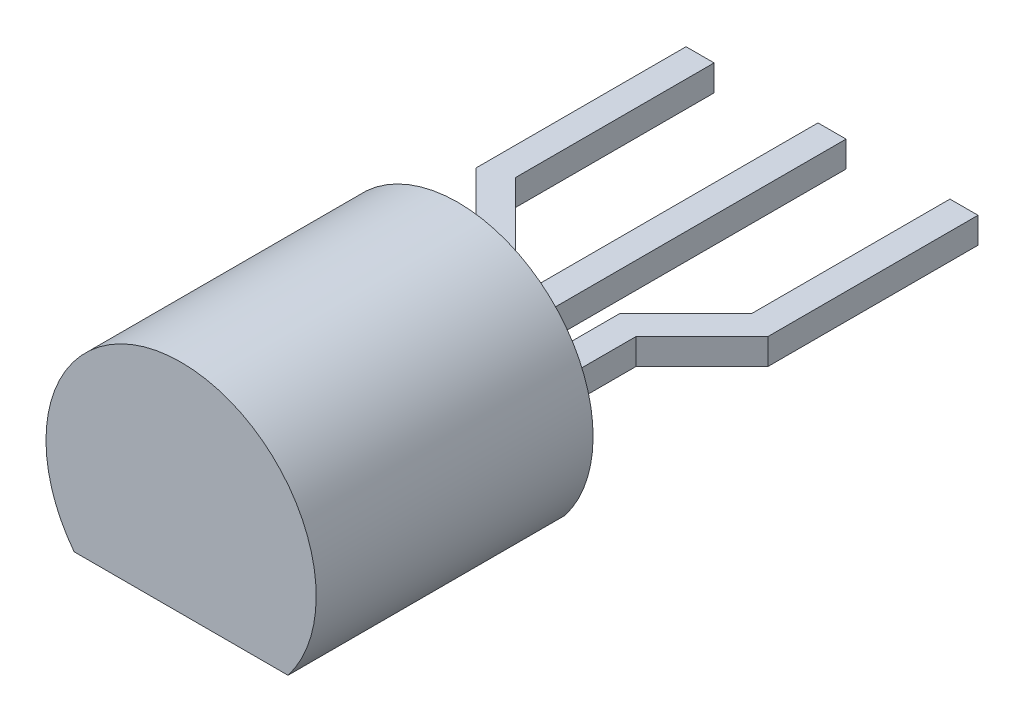
ISO-10303-21;
HEADER;
FILE_DESCRIPTION(('STEP AP214'),'2;1');
FILE_NAME('part.step','',(''),(''),'','','');
FILE_SCHEMA(('AUTOMOTIVE_DESIGN { 1 0 10303 214 1 1 1 1 }'));
ENDSEC;
DATA;
#1=APPLICATION_CONTEXT('core data for automotive mechanical design processes');
#2=APPLICATION_PROTOCOL_DEFINITION('international standard','automotive_design',2000,#1);
#3=PRODUCT_CONTEXT('',#1,'mechanical');
#4=PRODUCT('Part','Part','',(#3));
#5=PRODUCT_RELATED_PRODUCT_CATEGORY('part','',(#4));
#6=PRODUCT_DEFINITION_FORMATION('','',#4);
#7=PRODUCT_DEFINITION_CONTEXT('part definition',#1,'design');
#8=PRODUCT_DEFINITION('design','',#6,#7);
#9=PRODUCT_DEFINITION_SHAPE('','',#8);
#10=(LENGTH_UNIT() NAMED_UNIT(*) SI_UNIT(.MILLI.,.METRE.));
#11=(NAMED_UNIT(*) PLANE_ANGLE_UNIT() SI_UNIT($,.RADIAN.));
#12=(NAMED_UNIT(*) SI_UNIT($,.STERADIAN.) SOLID_ANGLE_UNIT());
#13=UNCERTAINTY_MEASURE_WITH_UNIT(LENGTH_MEASURE(1.E-05),#10,'distance_accuracy_value','');
#14=(GEOMETRIC_REPRESENTATION_CONTEXT(3) GLOBAL_UNCERTAINTY_ASSIGNED_CONTEXT((#13)) GLOBAL_UNIT_ASSIGNED_CONTEXT((#10,
#11,#12)) REPRESENTATION_CONTEXT('',''));
#15=CARTESIAN_POINT('',(0.,0.,0.));
#16=DIRECTION('',(0.,0.,1.));
#17=DIRECTION('',(1.,0.,0.));
#18=AXIS2_PLACEMENT_3D('',#15,#16,#17);
#19=CARTESIAN_POINT('',(-0.27,0.25,-3.2));
#20=DIRECTION('',(0.,1.,0.));
#21=DIRECTION('',(0.,0.,1.));
#22=AXIS2_PLACEMENT_3D('',#19,#20,#21);
#23=PLANE('',#22);
#24=DIRECTION('',(1.,0.,0.));
#25=VECTOR('',#24,1.);
#26=CARTESIAN_POINT('',(0.,0.25,-3.2));
#27=LINE('',#26,#25);
#28=CARTESIAN_POINT('',(0.27,0.25,-3.2));
#29=VERTEX_POINT('',#28);
#30=CARTESIAN_POINT('',(-0.27,0.25,-3.2));
#31=VERTEX_POINT('',#30);
#32=EDGE_CURVE('P0_E54',#29,#31,#27,.F.);
#33=ORIENTED_EDGE('',*,*,#32,.T.);
#34=DIRECTION('',(0.,0.,1.));
#35=VECTOR('',#34,1.);
#36=CARTESIAN_POINT('',(-0.27,0.25,-3.2));
#37=LINE('',#36,#35);
#38=CARTESIAN_POINT('',(-0.27,0.25,4.));
#39=VERTEX_POINT('',#38);
#40=EDGE_CURVE('P0_E66',#39,#31,#37,.F.);
#41=ORIENTED_EDGE('',*,*,#40,.F.);
#42=DIRECTION('',(1.,0.,0.));
#43=VECTOR('',#42,1.);
#44=CARTESIAN_POINT('',(0.,0.25,4.));
#45=LINE('',#44,#43);
#46=CARTESIAN_POINT('',(0.27,0.25,4.));
#47=VERTEX_POINT('',#46);
#48=EDGE_CURVE('P0_E19',#47,#39,#45,.F.);
#49=ORIENTED_EDGE('',*,*,#48,.F.);
#50=DIRECTION('',(0.,0.,-1.));
#51=VECTOR('',#50,1.);
#52=CARTESIAN_POINT('',(0.27,0.25,-3.2));
#53=LINE('',#52,#51);
#54=EDGE_CURVE('P0_E80',#29,#47,#53,.F.);
#55=ORIENTED_EDGE('',*,*,#54,.F.);
#56=EDGE_LOOP('',(#33,#41,#49,#55));
#57=FACE_BOUND('',#56,.T.);
#58=ADVANCED_FACE('P0_F16',(#57),#23,.T.);
#59=CARTESIAN_POINT('',(0.,0.,4.));
#60=DIRECTION('',(0.,0.,1.));
#61=DIRECTION('',(1.,0.,0.));
#62=AXIS2_PLACEMENT_3D('',#59,#60,#61);
#63=PLANE('',#62);
#64=ORIENTED_EDGE('',*,*,#48,.T.);
#65=DIRECTION('',(0.,1.,0.));
#66=VECTOR('',#65,1.);
#67=CARTESIAN_POINT('',(-0.27,-0.25,4.));
#68=LINE('',#67,#66);
#69=CARTESIAN_POINT('',(-0.27,-0.25,4.));
#70=VERTEX_POINT('',#69);
#71=EDGE_CURVE('P0_E61',#70,#39,#68,.T.);
#72=ORIENTED_EDGE('',*,*,#71,.F.);
#73=DIRECTION('',(1.,0.,0.));
#74=VECTOR('',#73,1.);
#75=CARTESIAN_POINT('',(0.27,-0.25,4.));
#76=LINE('',#75,#74);
#77=CARTESIAN_POINT('',(0.27,-0.25,4.));
#78=VERTEX_POINT('',#77);
#79=EDGE_CURVE('P0_E82',#78,#70,#76,.F.);
#80=ORIENTED_EDGE('',*,*,#79,.F.);
#81=DIRECTION('',(0.,1.,0.));
#82=VECTOR('',#81,1.);
#83=CARTESIAN_POINT('',(0.27,0.25,4.));
#84=LINE('',#83,#82);
#85=EDGE_CURVE('P0_E64',#47,#78,#84,.F.);
#86=ORIENTED_EDGE('',*,*,#85,.F.);
#87=EDGE_LOOP('',(#64,#72,#80,#86));
#88=FACE_BOUND('',#87,.T.);
#89=ADVANCED_FACE('P0_F59',(#88),#63,.T.);
#90=CARTESIAN_POINT('',(-0.27,-0.25,-3.2));
#91=DIRECTION('',(-1.,0.,0.));
#92=DIRECTION('',(0.,0.,1.));
#93=AXIS2_PLACEMENT_3D('',#90,#91,#92);
#94=PLANE('',#93);
#95=DIRECTION('',(0.,1.,0.));
#96=VECTOR('',#95,1.);
#97=CARTESIAN_POINT('',(-0.27,0.,-3.2));
#98=LINE('',#97,#96);
#99=CARTESIAN_POINT('',(-0.27,-0.25,-3.2));
#100=VERTEX_POINT('',#99);
#101=EDGE_CURVE('P0_E76',#31,#100,#98,.F.);
#102=ORIENTED_EDGE('',*,*,#101,.T.);
#103=DIRECTION('',(0.,0.,-1.));
#104=VECTOR('',#103,1.);
#105=CARTESIAN_POINT('',(-0.27,-0.25,-3.2));
#106=LINE('',#105,#104);
#107=EDGE_CURVE('P0_E72',#70,#100,#106,.T.);
#108=ORIENTED_EDGE('',*,*,#107,.F.);
#109=ORIENTED_EDGE('',*,*,#71,.T.);
#110=ORIENTED_EDGE('',*,*,#40,.T.);
#111=EDGE_LOOP('',(#102,#108,#109,#110));
#112=FACE_BOUND('',#111,.T.);
#113=ADVANCED_FACE('P0_F70',(#112),#94,.T.);
#114=CARTESIAN_POINT('',(0.,0.,-3.2));
#115=DIRECTION('',(0.,0.,1.));
#116=DIRECTION('',(1.,0.,0.));
#117=AXIS2_PLACEMENT_3D('',#114,#115,#116);
#118=PLANE('',#117);
#119=DIRECTION('',(1.,0.,0.));
#120=VECTOR('',#119,1.);
#121=CARTESIAN_POINT('',(0.27,-0.25,-3.2));
#122=LINE('',#121,#120);
#123=CARTESIAN_POINT('',(0.27,-0.25,-3.2));
#124=VERTEX_POINT('',#123);
#125=EDGE_CURVE('P0_E25',#100,#124,#122,.T.);
#126=ORIENTED_EDGE('',*,*,#125,.F.);
#127=ORIENTED_EDGE('',*,*,#101,.F.);
#128=ORIENTED_EDGE('',*,*,#32,.F.);
#129=DIRECTION('',(0.,1.,0.));
#130=VECTOR('',#129,1.);
#131=CARTESIAN_POINT('',(0.27,0.25,-3.2));
#132=LINE('',#131,#130);
#133=EDGE_CURVE('P0_E34',#124,#29,#132,.T.);
#134=ORIENTED_EDGE('',*,*,#133,.F.);
#135=EDGE_LOOP('',(#126,#127,#128,#134));
#136=FACE_BOUND('',#135,.T.);
#137=ADVANCED_FACE('P0_F88',(#136),#118,.F.);
#138=CARTESIAN_POINT('',(0.27,0.25,-3.2));
#139=DIRECTION('',(1.,0.,0.));
#140=DIRECTION('',(0.,0.,-1.));
#141=AXIS2_PLACEMENT_3D('',#138,#139,#140);
#142=PLANE('',#141);
#143=ORIENTED_EDGE('',*,*,#133,.T.);
#144=ORIENTED_EDGE('',*,*,#54,.T.);
#145=ORIENTED_EDGE('',*,*,#85,.T.);
#146=DIRECTION('',(0.,0.,-1.));
#147=VECTOR('',#146,1.);
#148=CARTESIAN_POINT('',(0.27,-0.25,-3.2));
#149=LINE('',#148,#147);
#150=EDGE_CURVE('P0_E11',#124,#78,#149,.F.);
#151=ORIENTED_EDGE('',*,*,#150,.F.);
#152=EDGE_LOOP('',(#143,#144,#145,#151));
#153=FACE_BOUND('',#152,.T.);
#154=ADVANCED_FACE('P0_F90',(#153),#142,.T.);
#155=CARTESIAN_POINT('',(0.27,-0.25,-3.2));
#156=DIRECTION('',(0.,-1.,0.));
#157=DIRECTION('',(0.,0.,-1.));
#158=AXIS2_PLACEMENT_3D('',#155,#156,#157);
#159=PLANE('',#158);
#160=ORIENTED_EDGE('',*,*,#125,.T.);
#161=ORIENTED_EDGE('',*,*,#150,.T.);
#162=ORIENTED_EDGE('',*,*,#79,.T.);
#163=ORIENTED_EDGE('',*,*,#107,.T.);
#164=EDGE_LOOP('',(#160,#161,#162,#163));
#165=FACE_BOUND('',#164,.T.);
#166=ADVANCED_FACE('P0_F87',(#165),#159,.T.);
#167=CLOSED_SHELL('',(#58,#89,#113,#137,#154,#166));
#168=MANIFOLD_SOLID_BREP('P0_B1',#167);
#169=CARTESIAN_POINT('',(0.,0.145540892945,9.33));
#170=DIRECTION('',(0.,0.,1.));
#171=DIRECTION('',(1.,0.,0.));
#172=AXIS2_PLACEMENT_3D('',#169,#170,#171);
#173=PLANE('',#172);
#174=DIRECTION('',(1.,0.,0.));
#175=VECTOR('',#174,1.);
#176=CARTESIAN_POINT('',(2.058536051832,-1.53,9.33));
#177=LINE('',#176,#175);
#178=CARTESIAN_POINT('',(2.0585360518316,-1.52999999999988,9.33));
#179=VERTEX_POINT('',#178);
#180=CARTESIAN_POINT('',(-2.0585360518316,-1.52999999999988,9.33));
#181=VERTEX_POINT('',#180);
#182=EDGE_CURVE('P1_E42',#179,#181,#177,.F.);
#183=ORIENTED_EDGE('',*,*,#182,.F.);
#184=CARTESIAN_POINT('',(0.,0.05932330827068,9.33));
#185=DIRECTION('',(0.,0.,1.));
#186=DIRECTION('',(1.,0.,0.));
#187=AXIS2_PLACEMENT_3D('',#184,#185,#186);
#188=CIRCLE('',#187,2.600676691729);
#189=EDGE_CURVE('P1_E19',#181,#179,#188,.F.);
#190=ORIENTED_EDGE('',*,*,#189,.F.);
#191=EDGE_LOOP('',(#183,#190));
#192=FACE_BOUND('',#191,.T.);
#193=ADVANCED_FACE('P1_F16',(#192),#173,.T.);
#194=CARTESIAN_POINT('',(0.,0.145540892945,4.));
#195=DIRECTION('',(0.,0.,1.));
#196=DIRECTION('',(1.,0.,0.));
#197=AXIS2_PLACEMENT_3D('',#194,#195,#196);
#198=PLANE('',#197);
#199=DIRECTION('',(1.,0.,0.));
#200=VECTOR('',#199,1.);
#201=CARTESIAN_POINT('',(2.058536051832,-1.53,4.));
#202=LINE('',#201,#200);
#203=CARTESIAN_POINT('',(-2.0585360518316,-1.52999999999988,4.));
#204=VERTEX_POINT('',#203);
#205=CARTESIAN_POINT('',(2.0585360518316,-1.52999999999988,4.));
#206=VERTEX_POINT('',#205);
#207=EDGE_CURVE('P1_E33',#204,#206,#202,.T.);
#208=ORIENTED_EDGE('',*,*,#207,.F.);
#209=CARTESIAN_POINT('',(0.,0.05932330827068,4.));
#210=DIRECTION('',(0.,0.,1.));
#211=DIRECTION('',(1.,0.,0.));
#212=AXIS2_PLACEMENT_3D('',#209,#210,#211);
#213=CIRCLE('',#212,2.600676691729);
#214=EDGE_CURVE('P1_E25',#206,#204,#213,.T.);
#215=ORIENTED_EDGE('',*,*,#214,.F.);
#216=EDGE_LOOP('',(#208,#215));
#217=FACE_BOUND('',#216,.T.);
#218=ADVANCED_FACE('P1_F54',(#217),#198,.F.);
#219=CARTESIAN_POINT('',(2.058536051832,-1.53,4.));
#220=DIRECTION('',(0.,-1.,0.));
#221=DIRECTION('',(0.,0.,-1.));
#222=AXIS2_PLACEMENT_3D('',#219,#220,#221);
#223=PLANE('',#222);
#224=ORIENTED_EDGE('',*,*,#207,.T.);
#225=DIRECTION('',(0.,0.,1.));
#226=VECTOR('',#225,1.);
#227=CARTESIAN_POINT('',(2.05853605183169,-1.52999999999976,4.));
#228=LINE('',#227,#226);
#229=EDGE_CURVE('P1_E47',#179,#206,#228,.F.);
#230=ORIENTED_EDGE('',*,*,#229,.F.);
#231=ORIENTED_EDGE('',*,*,#182,.T.);
#232=DIRECTION('',(0.,0.,1.));
#233=VECTOR('',#232,1.);
#234=CARTESIAN_POINT('',(-2.05853605183169,-1.52999999999976,4.));
#235=LINE('',#234,#233);
#236=EDGE_CURVE('P1_E11',#204,#181,#235,.T.);
#237=ORIENTED_EDGE('',*,*,#236,.F.);
#238=EDGE_LOOP('',(#224,#230,#231,#237));
#239=FACE_BOUND('',#238,.T.);
#240=ADVANCED_FACE('P1_F48',(#239),#223,.T.);
#241=CARTESIAN_POINT('',(0.,0.05932330827068,4.));
#242=DIRECTION('',(0.,0.,1.));
#243=DIRECTION('',(1.,0.,0.));
#244=AXIS2_PLACEMENT_3D('',#241,#242,#243);
#245=CYLINDRICAL_SURFACE('',#244,2.600676691729);
#246=ORIENTED_EDGE('',*,*,#214,.T.);
#247=ORIENTED_EDGE('',*,*,#236,.T.);
#248=ORIENTED_EDGE('',*,*,#189,.T.);
#249=ORIENTED_EDGE('',*,*,#229,.T.);
#250=EDGE_LOOP('',(#246,#247,#248,#249));
#251=FACE_BOUND('',#250,.T.);
#252=ADVANCED_FACE('P1_F52',(#251),#245,.T.);
#253=CLOSED_SHELL('',(#193,#218,#240,#252));
#254=MANIFOLD_SOLID_BREP('P1_B1',#253);
#255=CARTESIAN_POINT('',(-2.81,0.25,-3.2));
#256=DIRECTION('',(0.,1.,0.));
#257=DIRECTION('',(0.,0.,1.));
#258=AXIS2_PLACEMENT_3D('',#255,#256,#257);
#259=PLANE('',#258);
#260=DIRECTION('',(0.,0.,-1.));
#261=VECTOR('',#260,1.);
#262=CARTESIAN_POINT('',(-1.,0.25,2.));
#263=LINE('',#262,#261);
#264=CARTESIAN_POINT('',(-1.00000000000025,0.25,1.88816233815925));
#265=VERTEX_POINT('',#264);
#266=CARTESIAN_POINT('',(-1.,0.25,4.));
#267=VERTEX_POINT('',#266);
#268=EDGE_CURVE('P2_E78',#265,#267,#263,.F.);
#269=ORIENTED_EDGE('',*,*,#268,.F.);
#270=DIRECTION('',(-0.707106781186548,0.,-0.707106781186548));
#271=VECTOR('',#270,1.);
#272=CARTESIAN_POINT('',(-2.34908116908,0.25,0.53908116908));
#273=LINE('',#272,#271);
#274=CARTESIAN_POINT('',(-2.27000000000025,0.25,0.618162338159251));
#275=VERTEX_POINT('',#274);
#276=EDGE_CURVE('P2_E19',#275,#265,#273,.F.);
#277=ORIENTED_EDGE('',*,*,#276,.F.);
#278=DIRECTION('',(0.,0.,-1.));
#279=VECTOR('',#278,1.);
#280=CARTESIAN_POINT('',(-2.27,0.25,-3.2));
#281=LINE('',#280,#279);
#282=CARTESIAN_POINT('',(-2.27,0.25,-3.2));
#283=VERTEX_POINT('',#282);
#284=EDGE_CURVE('P2_E126',#283,#275,#281,.F.);
#285=ORIENTED_EDGE('',*,*,#284,.F.);
#286=DIRECTION('',(1.,0.,0.));
#287=VECTOR('',#286,1.);
#288=CARTESIAN_POINT('',(-2.54,0.25,-3.2));
#289=LINE('',#288,#287);
#290=CARTESIAN_POINT('',(-2.81,0.25,-3.2));
#291=VERTEX_POINT('',#290);
#292=EDGE_CURVE('P2_E120',#283,#291,#289,.F.);
#293=ORIENTED_EDGE('',*,*,#292,.T.);
#294=DIRECTION('',(0.,0.,1.));
#295=VECTOR('',#294,1.);
#296=CARTESIAN_POINT('',(-2.81,0.25,-3.2));
#297=LINE('',#296,#295);
#298=CARTESIAN_POINT('',(-2.80999999999988,0.25,0.841837661840874));
#299=VERTEX_POINT('',#298);
#300=EDGE_CURVE('P2_E114',#299,#291,#297,.F.);
#301=ORIENTED_EDGE('',*,*,#300,.F.);
#302=DIRECTION('',(0.707106781186548,0.,0.707106781186548));
#303=VECTOR('',#302,1.);
#304=CARTESIAN_POINT('',(-2.73091883092,0.25,0.92091883092));
#305=LINE('',#304,#303);
#306=CARTESIAN_POINT('',(-1.53999999999988,0.25,2.11183766184088));
#307=VERTEX_POINT('',#306);
#308=EDGE_CURVE('P2_E111',#307,#299,#305,.F.);
#309=ORIENTED_EDGE('',*,*,#308,.F.);
#310=DIRECTION('',(0.,0.,1.));
#311=VECTOR('',#310,1.);
#312=CARTESIAN_POINT('',(-1.54,0.25,2.));
#313=LINE('',#312,#311);
#314=CARTESIAN_POINT('',(-1.54,0.25,4.));
#315=VERTEX_POINT('',#314);
#316=EDGE_CURVE('P2_E106',#315,#307,#313,.F.);
#317=ORIENTED_EDGE('',*,*,#316,.F.);
#318=DIRECTION('',(1.,0.,0.));
#319=VECTOR('',#318,1.);
#320=CARTESIAN_POINT('',(-1.27,0.25,4.));
#321=LINE('',#320,#319);
#322=EDGE_CURVE('P2_E92',#267,#315,#321,.F.);
#323=ORIENTED_EDGE('',*,*,#322,.F.);
#324=EDGE_LOOP('',(#269,#277,#285,#293,#301,#309,#317,#323));
#325=FACE_BOUND('',#324,.T.);
#326=ADVANCED_FACE('P2_F16',(#325),#259,.T.);
#327=CARTESIAN_POINT('',(-2.34908116908,0.25,0.53908116908));
#328=DIRECTION('',(0.707106781186548,0.,-0.707106781186548));
#329=DIRECTION('',(-0.707106781186548,0.,-0.707106781186548));
#330=AXIS2_PLACEMENT_3D('',#327,#328,#329);
#331=PLANE('',#330);
#332=DIRECTION('',(0.,1.,0.));
#333=VECTOR('',#332,1.);
#334=CARTESIAN_POINT('',(-1.,0.25,1.888162338159));
#335=LINE('',#334,#333);
#336=CARTESIAN_POINT('',(-1.00000000000025,-0.25,1.88816233815925));
#337=VERTEX_POINT('',#336);
#338=EDGE_CURVE('P2_E84',#337,#265,#335,.T.);
#339=ORIENTED_EDGE('',*,*,#338,.F.);
#340=DIRECTION('',(0.707106781186547,0.,0.707106781186547));
#341=VECTOR('',#340,1.);
#342=CARTESIAN_POINT('',(-2.27,-0.25,0.618162338159));
#343=LINE('',#342,#341);
#344=CARTESIAN_POINT('',(-2.27000000000025,-0.25,0.61816233815925));
#345=VERTEX_POINT('',#344);
#346=EDGE_CURVE('P2_E128',#345,#337,#343,.T.);
#347=ORIENTED_EDGE('',*,*,#346,.F.);
#348=DIRECTION('',(0.,1.,0.));
#349=VECTOR('',#348,1.);
#350=CARTESIAN_POINT('',(-2.27,0.25,0.618162338159));
#351=LINE('',#350,#349);
#352=EDGE_CURVE('P2_E87',#275,#345,#351,.F.);
#353=ORIENTED_EDGE('',*,*,#352,.F.);
#354=ORIENTED_EDGE('',*,*,#276,.T.);
#355=EDGE_LOOP('',(#339,#347,#353,#354));
#356=FACE_BOUND('',#355,.T.);
#357=ADVANCED_FACE('P2_F83',(#356),#331,.T.);
#358=CARTESIAN_POINT('',(-1.,0.25,2.));
#359=DIRECTION('',(1.,0.,0.));
#360=DIRECTION('',(0.,0.,-1.));
#361=AXIS2_PLACEMENT_3D('',#358,#359,#360);
#362=PLANE('',#361);
#363=ORIENTED_EDGE('',*,*,#338,.T.);
#364=ORIENTED_EDGE('',*,*,#268,.T.);
#365=DIRECTION('',(0.,1.,0.));
#366=VECTOR('',#365,1.);
#367=CARTESIAN_POINT('',(-1.,0.,4.));
#368=LINE('',#367,#366);
#369=CARTESIAN_POINT('',(-1.,-0.25,4.));
#370=VERTEX_POINT('',#369);
#371=EDGE_CURVE('P2_E94',#370,#267,#368,.T.);
#372=ORIENTED_EDGE('',*,*,#371,.F.);
#373=DIRECTION('',(0.,0.,-1.));
#374=VECTOR('',#373,1.);
#375=CARTESIAN_POINT('',(-1.,-0.25,-3.2));
#376=LINE('',#375,#374);
#377=EDGE_CURVE('P2_E98',#337,#370,#376,.F.);
#378=ORIENTED_EDGE('',*,*,#377,.F.);
#379=EDGE_LOOP('',(#363,#364,#372,#378));
#380=FACE_BOUND('',#379,.T.);
#381=ADVANCED_FACE('P2_F96',(#380),#362,.T.);
#382=CARTESIAN_POINT('',(-1.27,0.,4.));
#383=DIRECTION('',(0.,0.,1.));
#384=DIRECTION('',(1.,0.,0.));
#385=AXIS2_PLACEMENT_3D('',#382,#383,#384);
#386=PLANE('',#385);
#387=ORIENTED_EDGE('',*,*,#322,.T.);
#388=DIRECTION('',(0.,1.,0.));
#389=VECTOR('',#388,1.);
#390=CARTESIAN_POINT('',(-1.54,-0.25,4.));
#391=LINE('',#390,#389);
#392=CARTESIAN_POINT('',(-1.54,-0.25,4.));
#393=VERTEX_POINT('',#392);
#394=EDGE_CURVE('P2_E103',#393,#315,#391,.T.);
#395=ORIENTED_EDGE('',*,*,#394,.F.);
#396=DIRECTION('',(1.,0.,0.));
#397=VECTOR('',#396,1.);
#398=CARTESIAN_POINT('',(-2.27,-0.25,4.));
#399=LINE('',#398,#397);
#400=EDGE_CURVE('P2_E131',#370,#393,#399,.F.);
#401=ORIENTED_EDGE('',*,*,#400,.F.);
#402=ORIENTED_EDGE('',*,*,#371,.T.);
#403=EDGE_LOOP('',(#387,#395,#401,#402));
#404=FACE_BOUND('',#403,.T.);
#405=ADVANCED_FACE('P2_F160',(#404),#386,.T.);
#406=CARTESIAN_POINT('',(-1.54,-0.25,2.));
#407=DIRECTION('',(-1.,0.,0.));
#408=DIRECTION('',(0.,0.,1.));
#409=AXIS2_PLACEMENT_3D('',#406,#407,#408);
#410=PLANE('',#409);
#411=ORIENTED_EDGE('',*,*,#394,.T.);
#412=ORIENTED_EDGE('',*,*,#316,.T.);
#413=DIRECTION('',(0.,1.,0.));
#414=VECTOR('',#413,1.);
#415=CARTESIAN_POINT('',(-1.5399999999995,-0.25,2.1118376618405));
#416=LINE('',#415,#414);
#417=CARTESIAN_POINT('',(-1.53999999999988,-0.25,2.11183766184087));
#418=VERTEX_POINT('',#417);
#419=EDGE_CURVE('P2_E108',#418,#307,#416,.T.);
#420=ORIENTED_EDGE('',*,*,#419,.F.);
#421=DIRECTION('',(0.,0.,-1.));
#422=VECTOR('',#421,1.);
#423=CARTESIAN_POINT('',(-1.54,-0.25,-3.2));
#424=LINE('',#423,#422);
#425=EDGE_CURVE('P2_E134',#393,#418,#424,.T.);
#426=ORIENTED_EDGE('',*,*,#425,.F.);
#427=EDGE_LOOP('',(#411,#412,#420,#426));
#428=FACE_BOUND('',#427,.T.);
#429=ADVANCED_FACE('P2_F157',(#428),#410,.T.);
#430=CARTESIAN_POINT('',(-2.73091883092,-0.25,0.92091883092));
#431=DIRECTION('',(-0.707106781186548,0.,0.707106781186548));
#432=DIRECTION('',(0.707106781186548,0.,0.707106781186548));
#433=AXIS2_PLACEMENT_3D('',#430,#431,#432);
#434=PLANE('',#433);
#435=DIRECTION('',(0.,1.,0.));
#436=VECTOR('',#435,1.);
#437=CARTESIAN_POINT('',(-2.81,-0.25,0.841837661841));
#438=LINE('',#437,#436);
#439=CARTESIAN_POINT('',(-2.80999999999975,-0.25,0.84183766184075));
#440=VERTEX_POINT('',#439);
#441=EDGE_CURVE('P2_E117',#440,#299,#438,.T.);
#442=ORIENTED_EDGE('',*,*,#441,.F.);
#443=DIRECTION('',(-0.707106781186547,0.,-0.707106781186548));
#444=VECTOR('',#443,1.);
#445=CARTESIAN_POINT('',(-1.54,-0.25,2.111837661841));
#446=LINE('',#445,#444);
#447=EDGE_CURVE('P2_E137',#418,#440,#446,.T.);
#448=ORIENTED_EDGE('',*,*,#447,.F.);
#449=ORIENTED_EDGE('',*,*,#419,.T.);
#450=ORIENTED_EDGE('',*,*,#308,.T.);
#451=EDGE_LOOP('',(#442,#448,#449,#450));
#452=FACE_BOUND('',#451,.T.);
#453=ADVANCED_FACE('P2_F153',(#452),#434,.T.);
#454=CARTESIAN_POINT('',(-2.81,-0.25,-3.2));
#455=DIRECTION('',(-1.,0.,0.));
#456=DIRECTION('',(0.,0.,1.));
#457=AXIS2_PLACEMENT_3D('',#454,#455,#456);
#458=PLANE('',#457);
#459=DIRECTION('',(0.,0.,-1.));
#460=VECTOR('',#459,1.);
#461=CARTESIAN_POINT('',(-2.81,-0.25,-3.2));
#462=LINE('',#461,#460);
#463=CARTESIAN_POINT('',(-2.81,-0.25,-3.2));
#464=VERTEX_POINT('',#463);
#465=EDGE_CURVE('P2_E140',#440,#464,#462,.T.);
#466=ORIENTED_EDGE('',*,*,#465,.F.);
#467=ORIENTED_EDGE('',*,*,#441,.T.);
#468=ORIENTED_EDGE('',*,*,#300,.T.);
#469=DIRECTION('',(0.,1.,0.));
#470=VECTOR('',#469,1.);
#471=CARTESIAN_POINT('',(-2.81,0.,-3.2));
#472=LINE('',#471,#470);
#473=EDGE_CURVE('P2_E122',#291,#464,#472,.F.);
#474=ORIENTED_EDGE('',*,*,#473,.T.);
#475=EDGE_LOOP('',(#466,#467,#468,#474));
#476=FACE_BOUND('',#475,.T.);
#477=ADVANCED_FACE('P2_F150',(#476),#458,.T.);
#478=CARTESIAN_POINT('',(-2.54,0.,-3.2));
#479=DIRECTION('',(0.,0.,1.));
#480=DIRECTION('',(1.,0.,0.));
#481=AXIS2_PLACEMENT_3D('',#478,#479,#480);
#482=PLANE('',#481);
#483=DIRECTION('',(1.,0.,0.));
#484=VECTOR('',#483,1.);
#485=CARTESIAN_POINT('',(-2.27,-0.25,-3.2));
#486=LINE('',#485,#484);
#487=CARTESIAN_POINT('',(-2.27,-0.25,-3.2));
#488=VERTEX_POINT('',#487);
#489=EDGE_CURVE('P2_E25',#464,#488,#486,.T.);
#490=ORIENTED_EDGE('',*,*,#489,.F.);
#491=ORIENTED_EDGE('',*,*,#473,.F.);
#492=ORIENTED_EDGE('',*,*,#292,.F.);
#493=DIRECTION('',(0.,1.,0.));
#494=VECTOR('',#493,1.);
#495=CARTESIAN_POINT('',(-2.27,0.25,-3.2));
#496=LINE('',#495,#494);
#497=EDGE_CURVE('P2_E34',#488,#283,#496,.T.);
#498=ORIENTED_EDGE('',*,*,#497,.F.);
#499=EDGE_LOOP('',(#490,#491,#492,#498));
#500=FACE_BOUND('',#499,.T.);
#501=ADVANCED_FACE('P2_F148',(#500),#482,.F.);
#502=CARTESIAN_POINT('',(-2.27,0.25,-3.2));
#503=DIRECTION('',(1.,0.,0.));
#504=DIRECTION('',(0.,0.,-1.));
#505=AXIS2_PLACEMENT_3D('',#502,#503,#504);
#506=PLANE('',#505);
#507=ORIENTED_EDGE('',*,*,#497,.T.);
#508=ORIENTED_EDGE('',*,*,#284,.T.);
#509=ORIENTED_EDGE('',*,*,#352,.T.);
#510=DIRECTION('',(0.,0.,-1.));
#511=VECTOR('',#510,1.);
#512=CARTESIAN_POINT('',(-2.27,-0.25,-3.2));
#513=LINE('',#512,#511);
#514=EDGE_CURVE('P2_E11',#488,#345,#513,.F.);
#515=ORIENTED_EDGE('',*,*,#514,.F.);
#516=EDGE_LOOP('',(#507,#508,#509,#515));
#517=FACE_BOUND('',#516,.T.);
#518=ADVANCED_FACE('P2_F162',(#517),#506,.T.);
#519=CARTESIAN_POINT('',(-2.27,-0.25,-3.2));
#520=DIRECTION('',(0.,-1.,0.));
#521=DIRECTION('',(0.,0.,-1.));
#522=AXIS2_PLACEMENT_3D('',#519,#520,#521);
#523=PLANE('',#522);
#524=ORIENTED_EDGE('',*,*,#489,.T.);
#525=ORIENTED_EDGE('',*,*,#514,.T.);
#526=ORIENTED_EDGE('',*,*,#346,.T.);
#527=ORIENTED_EDGE('',*,*,#377,.T.);
#528=ORIENTED_EDGE('',*,*,#400,.T.);
#529=ORIENTED_EDGE('',*,*,#425,.T.);
#530=ORIENTED_EDGE('',*,*,#447,.T.);
#531=ORIENTED_EDGE('',*,*,#465,.T.);
#532=EDGE_LOOP('',(#524,#525,#526,#527,#528,#529,#530,#531));
#533=FACE_BOUND('',#532,.T.);
#534=ADVANCED_FACE('P2_F145',(#533),#523,.T.);
#535=CLOSED_SHELL('',(#326,#357,#381,#405,#429,#453,#477,#501,#518,#534));
#536=MANIFOLD_SOLID_BREP('P2_B1',#535);
#537=CARTESIAN_POINT('',(2.27,0.25,-3.2));
#538=DIRECTION('',(0.,1.,0.));
#539=DIRECTION('',(0.,0.,1.));
#540=AXIS2_PLACEMENT_3D('',#537,#538,#539);
#541=PLANE('',#540);
#542=DIRECTION('',(1.,0.,0.));
#543=VECTOR('',#542,1.);
#544=CARTESIAN_POINT('',(2.54,0.25,-3.2));
#545=LINE('',#544,#543);
#546=CARTESIAN_POINT('',(2.81,0.25,-3.2));
#547=VERTEX_POINT('',#546);
#548=CARTESIAN_POINT('',(2.27,0.25,-3.2));
#549=VERTEX_POINT('',#548);
#550=EDGE_CURVE('P3_E78',#547,#549,#545,.F.);
#551=ORIENTED_EDGE('',*,*,#550,.T.);
#552=DIRECTION('',(0.,0.,1.));
#553=VECTOR('',#552,1.);
#554=CARTESIAN_POINT('',(2.27,0.25,-3.2));
#555=LINE('',#554,#553);
#556=CARTESIAN_POINT('',(2.27000000000013,0.25,0.618162338159125));
#557=VERTEX_POINT('',#556);
#558=EDGE_CURVE('P3_E19',#557,#549,#555,.F.);
#559=ORIENTED_EDGE('',*,*,#558,.F.);
#560=DIRECTION('',(-0.707106781186548,0.,0.707106781186548));
#561=VECTOR('',#560,1.);
#562=CARTESIAN_POINT('',(2.34908116908,0.25,0.53908116908));
#563=LINE('',#562,#561);
#564=CARTESIAN_POINT('',(1.00000000000013,0.25,1.88816233815913));
#565=VERTEX_POINT('',#564);
#566=EDGE_CURVE('P3_E125',#565,#557,#563,.F.);
#567=ORIENTED_EDGE('',*,*,#566,.F.);
#568=DIRECTION('',(0.,0.,1.));
#569=VECTOR('',#568,1.);
#570=CARTESIAN_POINT('',(1.,0.25,2.));
#571=LINE('',#570,#569);
#572=CARTESIAN_POINT('',(1.,0.25,4.));
#573=VERTEX_POINT('',#572);
#574=EDGE_CURVE('P3_E121',#573,#565,#571,.F.);
#575=ORIENTED_EDGE('',*,*,#574,.F.);
#576=DIRECTION('',(1.,0.,0.));
#577=VECTOR('',#576,1.);
#578=CARTESIAN_POINT('',(1.27,0.25,4.));
#579=LINE('',#578,#577);
#580=CARTESIAN_POINT('',(1.54,0.25,4.));
#581=VERTEX_POINT('',#580);
#582=EDGE_CURVE('P3_E116',#581,#573,#579,.F.);
#583=ORIENTED_EDGE('',*,*,#582,.F.);
#584=DIRECTION('',(0.,0.,-1.));
#585=VECTOR('',#584,1.);
#586=CARTESIAN_POINT('',(1.54,0.25,2.));
#587=LINE('',#586,#585);
#588=CARTESIAN_POINT('',(1.53999999999975,0.25,2.11183766184075));
#589=VERTEX_POINT('',#588);
#590=EDGE_CURVE('P3_E111',#589,#581,#587,.F.);
#591=ORIENTED_EDGE('',*,*,#590,.F.);
#592=DIRECTION('',(0.707106781186548,0.,-0.707106781186548));
#593=VECTOR('',#592,1.);
#594=CARTESIAN_POINT('',(2.73091883092,0.25,0.92091883092));
#595=LINE('',#594,#593);
#596=CARTESIAN_POINT('',(2.80999999999988,0.25,0.841837661840875));
#597=VERTEX_POINT('',#596);
#598=EDGE_CURVE('P3_E106',#597,#589,#595,.F.);
#599=ORIENTED_EDGE('',*,*,#598,.F.);
#600=DIRECTION('',(0.,0.,-1.));
#601=VECTOR('',#600,1.);
#602=CARTESIAN_POINT('',(2.81,0.25,-3.2));
#603=LINE('',#602,#601);
#604=EDGE_CURVE('P3_E85',#547,#597,#603,.F.);
#605=ORIENTED_EDGE('',*,*,#604,.F.);
#606=EDGE_LOOP('',(#551,#559,#567,#575,#583,#591,#599,#605));
#607=FACE_BOUND('',#606,.T.);
#608=ADVANCED_FACE('P3_F16',(#607),#541,.T.);
#609=CARTESIAN_POINT('',(2.27,-0.25,-3.2));
#610=DIRECTION('',(-1.,0.,0.));
#611=DIRECTION('',(0.,0.,1.));
#612=AXIS2_PLACEMENT_3D('',#609,#610,#611);
#613=PLANE('',#612);
#614=DIRECTION('',(0.,1.,0.));
#615=VECTOR('',#614,1.);
#616=CARTESIAN_POINT('',(2.27,0.,-3.2));
#617=LINE('',#616,#615);
#618=CARTESIAN_POINT('',(2.27,-0.25,-3.2));
#619=VERTEX_POINT('',#618);
#620=EDGE_CURVE('P3_E87',#549,#619,#617,.F.);
#621=ORIENTED_EDGE('',*,*,#620,.T.);
#622=DIRECTION('',(0.,0.,-1.));
#623=VECTOR('',#622,1.);
#624=CARTESIAN_POINT('',(2.27,-0.25,-3.2));
#625=LINE('',#624,#623);
#626=CARTESIAN_POINT('',(2.27000000000012,-0.25,0.618162338159126));
#627=VERTEX_POINT('',#626);
#628=EDGE_CURVE('P3_E127',#627,#619,#625,.T.);
#629=ORIENTED_EDGE('',*,*,#628,.F.);
#630=DIRECTION('',(0.,1.,0.));
#631=VECTOR('',#630,1.);
#632=CARTESIAN_POINT('',(2.2700000000005,-0.25,0.6181623381595));
#633=LINE('',#632,#631);
#634=EDGE_CURVE('P3_E92',#557,#627,#633,.F.);
#635=ORIENTED_EDGE('',*,*,#634,.F.);
#636=ORIENTED_EDGE('',*,*,#558,.T.);
#637=EDGE_LOOP('',(#621,#629,#635,#636));
#638=FACE_BOUND('',#637,.T.);
#639=ADVANCED_FACE('P3_F89',(#638),#613,.T.);
#640=CARTESIAN_POINT('',(2.54,0.,-3.2));
#641=DIRECTION('',(0.,0.,1.));
#642=DIRECTION('',(1.,0.,0.));
#643=AXIS2_PLACEMENT_3D('',#640,#641,#642);
#644=PLANE('',#643);
#645=DIRECTION('',(1.,0.,0.));
#646=VECTOR('',#645,1.);
#647=CARTESIAN_POINT('',(2.81,-0.25,-3.2));
#648=LINE('',#647,#646);
#649=CARTESIAN_POINT('',(2.81,-0.25,-3.2));
#650=VERTEX_POINT('',#649);
#651=EDGE_CURVE('P3_E96',#619,#650,#648,.T.);
#652=ORIENTED_EDGE('',*,*,#651,.F.);
#653=ORIENTED_EDGE('',*,*,#620,.F.);
#654=ORIENTED_EDGE('',*,*,#550,.F.);
#655=DIRECTION('',(0.,1.,0.));
#656=VECTOR('',#655,1.);
#657=CARTESIAN_POINT('',(2.81,0.25,-3.2));
#658=LINE('',#657,#656);
#659=EDGE_CURVE('P3_E98',#650,#547,#658,.T.);
#660=ORIENTED_EDGE('',*,*,#659,.F.);
#661=EDGE_LOOP('',(#652,#653,#654,#660));
#662=FACE_BOUND('',#661,.T.);
#663=ADVANCED_FACE('P3_F94',(#662),#644,.F.);
#664=CARTESIAN_POINT('',(2.81,0.25,-3.2));
#665=DIRECTION('',(1.,0.,0.));
#666=DIRECTION('',(0.,0.,-1.));
#667=AXIS2_PLACEMENT_3D('',#664,#665,#666);
#668=PLANE('',#667);
#669=ORIENTED_EDGE('',*,*,#604,.T.);
#670=DIRECTION('',(0.,1.,0.));
#671=VECTOR('',#670,1.);
#672=CARTESIAN_POINT('',(2.8099999999995,0.25,0.8418376618405));
#673=LINE('',#672,#671);
#674=CARTESIAN_POINT('',(2.80999999999988,-0.25,0.841837661840874));
#675=VERTEX_POINT('',#674);
#676=EDGE_CURVE('P3_E103',#675,#597,#673,.T.);
#677=ORIENTED_EDGE('',*,*,#676,.F.);
#678=DIRECTION('',(0.,0.,-1.));
#679=VECTOR('',#678,1.);
#680=CARTESIAN_POINT('',(2.81,-0.25,-3.2));
#681=LINE('',#680,#679);
#682=EDGE_CURVE('P3_E130',#650,#675,#681,.F.);
#683=ORIENTED_EDGE('',*,*,#682,.F.);
#684=ORIENTED_EDGE('',*,*,#659,.T.);
#685=EDGE_LOOP('',(#669,#677,#683,#684));
#686=FACE_BOUND('',#685,.T.);
#687=ADVANCED_FACE('P3_F173',(#686),#668,.T.);
#688=CARTESIAN_POINT('',(2.73091883092,0.25,0.92091883092));
#689=DIRECTION('',(0.707106781186548,0.,0.707106781186548));
#690=DIRECTION('',(0.707106781186548,0.,-0.707106781186548));
#691=AXIS2_PLACEMENT_3D('',#688,#689,#690);
#692=PLANE('',#691);
#693=ORIENTED_EDGE('',*,*,#676,.T.);
#694=ORIENTED_EDGE('',*,*,#598,.T.);
#695=DIRECTION('',(0.,1.,0.));
#696=VECTOR('',#695,1.);
#697=CARTESIAN_POINT('',(1.54,0.25,2.111837661841));
#698=LINE('',#697,#696);
#699=CARTESIAN_POINT('',(1.53999999999975,-0.25,2.11183766184075));
#700=VERTEX_POINT('',#699);
#701=EDGE_CURVE('P3_E108',#700,#589,#698,.T.);
#702=ORIENTED_EDGE('',*,*,#701,.F.);
#703=DIRECTION('',(-0.707106781186547,0.,0.707106781186548));
#704=VECTOR('',#703,1.);
#705=CARTESIAN_POINT('',(2.81,-0.25,0.841837661841));
#706=LINE('',#705,#704);
#707=EDGE_CURVE('P3_E133',#675,#700,#706,.T.);
#708=ORIENTED_EDGE('',*,*,#707,.F.);
#709=EDGE_LOOP('',(#693,#694,#702,#708));
#710=FACE_BOUND('',#709,.T.);
#711=ADVANCED_FACE('P3_F169',(#710),#692,.T.);
#712=CARTESIAN_POINT('',(1.54,0.25,2.));
#713=DIRECTION('',(1.,0.,0.));
#714=DIRECTION('',(0.,0.,-1.));
#715=AXIS2_PLACEMENT_3D('',#712,#713,#714);
#716=PLANE('',#715);
#717=DIRECTION('',(0.,1.,0.));
#718=VECTOR('',#717,1.);
#719=CARTESIAN_POINT('',(1.54,0.,4.));
#720=LINE('',#719,#718);
#721=CARTESIAN_POINT('',(1.54,-0.25,4.));
#722=VERTEX_POINT('',#721);
#723=EDGE_CURVE('P3_E113',#722,#581,#720,.T.);
#724=ORIENTED_EDGE('',*,*,#723,.F.);
#725=DIRECTION('',(0.,0.,-1.));
#726=VECTOR('',#725,1.);
#727=CARTESIAN_POINT('',(1.54,-0.25,-3.2));
#728=LINE('',#727,#726);
#729=EDGE_CURVE('P3_E136',#700,#722,#728,.F.);
#730=ORIENTED_EDGE('',*,*,#729,.F.);
#731=ORIENTED_EDGE('',*,*,#701,.T.);
#732=ORIENTED_EDGE('',*,*,#590,.T.);
#733=EDGE_LOOP('',(#724,#730,#731,#732));
#734=FACE_BOUND('',#733,.T.);
#735=ADVANCED_FACE('P3_F166',(#734),#716,.T.);
#736=CARTESIAN_POINT('',(1.27,0.,4.));
#737=DIRECTION('',(0.,0.,1.));
#738=DIRECTION('',(1.,0.,0.));
#739=AXIS2_PLACEMENT_3D('',#736,#737,#738);
#740=PLANE('',#739);
#741=ORIENTED_EDGE('',*,*,#582,.T.);
#742=DIRECTION('',(0.,1.,0.));
#743=VECTOR('',#742,1.);
#744=CARTESIAN_POINT('',(1.,-0.25,4.));
#745=LINE('',#744,#743);
#746=CARTESIAN_POINT('',(1.,-0.25,4.));
#747=VERTEX_POINT('',#746);
#748=EDGE_CURVE('P3_E118',#747,#573,#745,.T.);
#749=ORIENTED_EDGE('',*,*,#748,.F.);
#750=DIRECTION('',(1.,0.,0.));
#751=VECTOR('',#750,1.);
#752=CARTESIAN_POINT('',(2.81,-0.25,4.));
#753=LINE('',#752,#751);
#754=EDGE_CURVE('P3_E139',#722,#747,#753,.F.);
#755=ORIENTED_EDGE('',*,*,#754,.F.);
#756=ORIENTED_EDGE('',*,*,#723,.T.);
#757=EDGE_LOOP('',(#741,#749,#755,#756));
#758=FACE_BOUND('',#757,.T.);
#759=ADVANCED_FACE('P3_F149',(#758),#740,.T.);
#760=CARTESIAN_POINT('',(1.,-0.25,2.));
#761=DIRECTION('',(-1.,0.,0.));
#762=DIRECTION('',(0.,0.,1.));
#763=AXIS2_PLACEMENT_3D('',#760,#761,#762);
#764=PLANE('',#763);
#765=DIRECTION('',(0.,1.,0.));
#766=VECTOR('',#765,1.);
#767=CARTESIAN_POINT('',(1.0000000000005,-0.25,1.8881623381595));
#768=LINE('',#767,#766);
#769=CARTESIAN_POINT('',(1.00000000000013,-0.25,1.88816233815913));
#770=VERTEX_POINT('',#769);
#771=EDGE_CURVE('P3_E34',#770,#565,#768,.T.);
#772=ORIENTED_EDGE('',*,*,#771,.F.);
#773=DIRECTION('',(0.,0.,-1.));
#774=VECTOR('',#773,1.);
#775=CARTESIAN_POINT('',(1.,-0.25,-3.2));
#776=LINE('',#775,#774);
#777=EDGE_CURVE('P3_E25',#747,#770,#776,.T.);
#778=ORIENTED_EDGE('',*,*,#777,.F.);
#779=ORIENTED_EDGE('',*,*,#748,.T.);
#780=ORIENTED_EDGE('',*,*,#574,.T.);
#781=EDGE_LOOP('',(#772,#778,#779,#780));
#782=FACE_BOUND('',#781,.T.);
#783=ADVANCED_FACE('P3_F146',(#782),#764,.T.);
#784=CARTESIAN_POINT('',(2.34908116908,-0.25,0.53908116908));
#785=DIRECTION('',(-0.707106781186548,0.,-0.707106781186548));
#786=DIRECTION('',(-0.707106781186548,0.,0.707106781186548));
#787=AXIS2_PLACEMENT_3D('',#784,#785,#786);
#788=PLANE('',#787);
#789=ORIENTED_EDGE('',*,*,#771,.T.);
#790=ORIENTED_EDGE('',*,*,#566,.T.);
#791=ORIENTED_EDGE('',*,*,#634,.T.);
#792=DIRECTION('',(0.707106781186547,0.,-0.707106781186547));
#793=VECTOR('',#792,1.);
#794=CARTESIAN_POINT('',(1.,-0.25,1.888162338159));
#795=LINE('',#794,#793);
#796=EDGE_CURVE('P3_E11',#770,#627,#795,.T.);
#797=ORIENTED_EDGE('',*,*,#796,.F.);
#798=EDGE_LOOP('',(#789,#790,#791,#797));
#799=FACE_BOUND('',#798,.T.);
#800=ADVANCED_FACE('P3_F153',(#799),#788,.T.);
#801=CARTESIAN_POINT('',(2.81,-0.25,-3.2));
#802=DIRECTION('',(0.,-1.,0.));
#803=DIRECTION('',(0.,0.,-1.));
#804=AXIS2_PLACEMENT_3D('',#801,#802,#803);
#805=PLANE('',#804);
#806=ORIENTED_EDGE('',*,*,#777,.T.);
#807=ORIENTED_EDGE('',*,*,#796,.T.);
#808=ORIENTED_EDGE('',*,*,#628,.T.);
#809=ORIENTED_EDGE('',*,*,#651,.T.);
#810=ORIENTED_EDGE('',*,*,#682,.T.);
#811=ORIENTED_EDGE('',*,*,#707,.T.);
#812=ORIENTED_EDGE('',*,*,#729,.T.);
#813=ORIENTED_EDGE('',*,*,#754,.T.);
#814=EDGE_LOOP('',(#806,#807,#808,#809,#810,#811,#812,#813));
#815=FACE_BOUND('',#814,.T.);
#816=ADVANCED_FACE('P3_F144',(#815),#805,.T.);
#817=CLOSED_SHELL('',(#608,#639,#663,#687,#711,#735,#759,#783,#800,#816));
#818=MANIFOLD_SOLID_BREP('P3_B1',#817);
#819=ADVANCED_BREP_SHAPE_REPRESENTATION('',(#18,#168,#254,#536,#818),#14);
#820=SHAPE_DEFINITION_REPRESENTATION(#9,#819);
ENDSEC;
END-ISO-10303-21;
